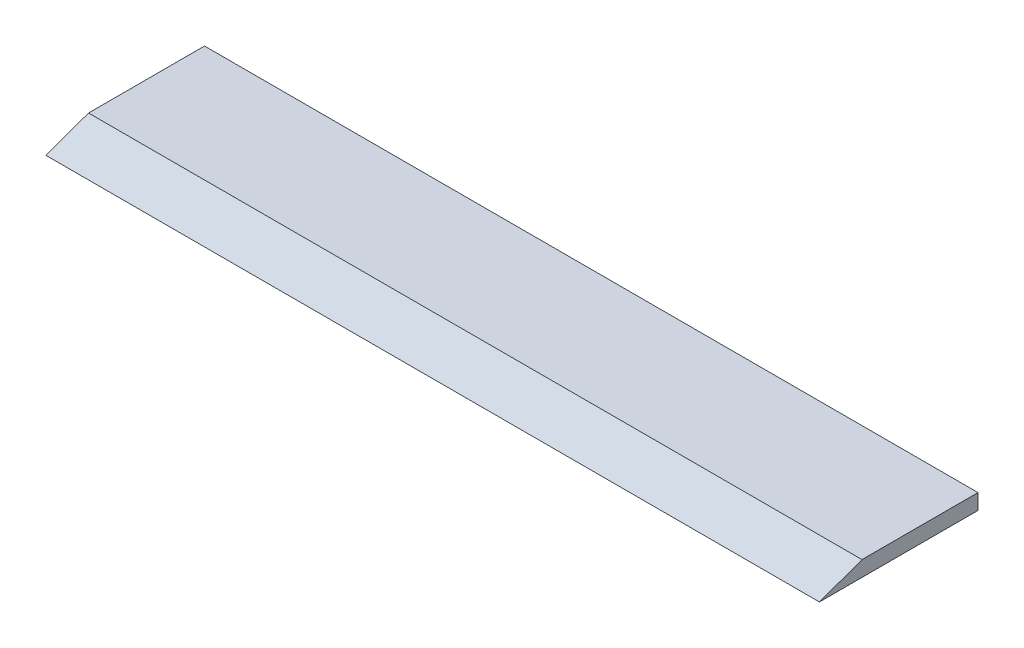
ISO-10303-21;
HEADER;
FILE_DESCRIPTION(('STEP AP214'),'2;1');
FILE_NAME('part.step','',(''),(''),'','','');
FILE_SCHEMA(('AUTOMOTIVE_DESIGN { 1 0 10303 214 1 1 1 1 }'));
ENDSEC;
DATA;
#1=APPLICATION_CONTEXT('core data for automotive mechanical design processes');
#2=APPLICATION_PROTOCOL_DEFINITION('international standard','automotive_design',2000,#1);
#3=PRODUCT_CONTEXT('',#1,'mechanical');
#4=PRODUCT('Part','Part','',(#3));
#5=PRODUCT_RELATED_PRODUCT_CATEGORY('part','',(#4));
#6=PRODUCT_DEFINITION_FORMATION('','',#4);
#7=PRODUCT_DEFINITION_CONTEXT('part definition',#1,'design');
#8=PRODUCT_DEFINITION('design','',#6,#7);
#9=PRODUCT_DEFINITION_SHAPE('','',#8);
#10=(LENGTH_UNIT() NAMED_UNIT(*) SI_UNIT(.MILLI.,.METRE.));
#11=(NAMED_UNIT(*) PLANE_ANGLE_UNIT() SI_UNIT($,.RADIAN.));
#12=(NAMED_UNIT(*) SI_UNIT($,.STERADIAN.) SOLID_ANGLE_UNIT());
#13=UNCERTAINTY_MEASURE_WITH_UNIT(LENGTH_MEASURE(1.E-05),#10,'distance_accuracy_value','');
#14=(GEOMETRIC_REPRESENTATION_CONTEXT(3) GLOBAL_UNCERTAINTY_ASSIGNED_CONTEXT((#13)) GLOBAL_UNIT_ASSIGNED_CONTEXT((#10,
#11,#12)) REPRESENTATION_CONTEXT('',''));
#15=CARTESIAN_POINT('',(0.,0.,0.));
#16=DIRECTION('',(0.,0.,1.));
#17=DIRECTION('',(1.,0.,0.));
#18=AXIS2_PLACEMENT_3D('',#15,#16,#17);
#19=CARTESIAN_POINT('',(200.,0.,0.));
#20=DIRECTION('',(0.,1.,0.));
#21=DIRECTION('',(0.,0.,1.));
#22=AXIS2_PLACEMENT_3D('',#19,#20,#21);
#23=PLANE('',#22);
#24=DIRECTION('',(0.,0.,-1.));
#25=VECTOR('',#24,1.);
#26=CARTESIAN_POINT('',(0.,0.,0.));
#27=LINE('',#26,#25);
#28=CARTESIAN_POINT('',(0.,0.,0.));
#29=VERTEX_POINT('',#28);
#30=CARTESIAN_POINT('',(0.,0.,-40.9899096778185));
#31=VERTEX_POINT('',#30);
#32=EDGE_CURVE('E107',#29,#31,#27,.T.);
#33=ORIENTED_EDGE('',*,*,#32,.T.);
#34=DIRECTION('',(-1.,0.,0.));
#35=VECTOR('',#34,1.);
#36=CARTESIAN_POINT('',(200.,0.,-40.9899096778185));
#37=LINE('',#36,#35);
#38=CARTESIAN_POINT('',(200.,0.,-40.9899096778185));
#39=VERTEX_POINT('',#38);
#40=EDGE_CURVE('E11',#39,#31,#37,.T.);
#41=ORIENTED_EDGE('',*,*,#40,.F.);
#42=DIRECTION('',(0.,0.,-1.));
#43=VECTOR('',#42,1.);
#44=CARTESIAN_POINT('',(200.,0.,0.));
#45=LINE('',#44,#43);
#46=CARTESIAN_POINT('',(200.,0.,0.));
#47=VERTEX_POINT('',#46);
#48=EDGE_CURVE('E91',#47,#39,#45,.T.);
#49=ORIENTED_EDGE('',*,*,#48,.F.);
#50=DIRECTION('',(-1.,0.,0.));
#51=VECTOR('',#50,1.);
#52=CARTESIAN_POINT('',(200.,0.,0.));
#53=LINE('',#52,#51);
#54=EDGE_CURVE('E103',#47,#29,#53,.T.);
#55=ORIENTED_EDGE('',*,*,#54,.T.);
#56=EDGE_LOOP('',(#33,#41,#49,#55));
#57=FACE_BOUND('',#56,.T.);
#58=ADVANCED_FACE('F39',(#57),#23,.F.);
#59=CARTESIAN_POINT('',(200.,0.,-40.9899096778185));
#60=DIRECTION('',(0.,0.,1.));
#61=DIRECTION('',(1.,0.,0.));
#62=AXIS2_PLACEMENT_3D('',#59,#60,#61);
#63=PLANE('',#62);
#64=DIRECTION('',(0.,1.,0.));
#65=VECTOR('',#64,1.);
#66=CARTESIAN_POINT('',(0.,0.,-40.9899096778185));
#67=LINE('',#66,#65);
#68=CARTESIAN_POINT('',(0.,4.,-40.9899096778185));
#69=VERTEX_POINT('',#68);
#70=EDGE_CURVE('E96',#31,#69,#67,.T.);
#71=ORIENTED_EDGE('',*,*,#70,.T.);
#72=DIRECTION('',(-1.,0.,0.));
#73=VECTOR('',#72,1.);
#74=CARTESIAN_POINT('',(200.,4.,-40.9899096778185));
#75=LINE('',#74,#73);
#76=CARTESIAN_POINT('',(200.,4.,-40.9899096778185));
#77=VERTEX_POINT('',#76);
#78=EDGE_CURVE('E48',#77,#69,#75,.T.);
#79=ORIENTED_EDGE('',*,*,#78,.F.);
#80=DIRECTION('',(0.,1.,0.));
#81=VECTOR('',#80,1.);
#82=CARTESIAN_POINT('',(200.,0.,-40.9899096778185));
#83=LINE('',#82,#81);
#84=EDGE_CURVE('E86',#39,#77,#83,.T.);
#85=ORIENTED_EDGE('',*,*,#84,.F.);
#86=ORIENTED_EDGE('',*,*,#40,.T.);
#87=EDGE_LOOP('',(#71,#79,#85,#86));
#88=FACE_BOUND('',#87,.T.);
#89=ADVANCED_FACE('F95',(#88),#63,.F.);
#90=CARTESIAN_POINT('',(200.,4.,-10.9899096778185));
#91=DIRECTION('',(0.,-1.,0.));
#92=DIRECTION('',(0.,0.,-1.));
#93=AXIS2_PLACEMENT_3D('',#90,#91,#92);
#94=PLANE('',#93);
#95=DIRECTION('',(0.,0.,1.));
#96=VECTOR('',#95,1.);
#97=CARTESIAN_POINT('',(0.,4.,-10.9899096778185));
#98=LINE('',#97,#96);
#99=CARTESIAN_POINT('',(0.,4.,-10.9899096778185));
#100=VERTEX_POINT('',#99);
#101=EDGE_CURVE('E73',#69,#100,#98,.T.);
#102=ORIENTED_EDGE('',*,*,#101,.T.);
#103=DIRECTION('',(-1.,0.,0.));
#104=VECTOR('',#103,1.);
#105=CARTESIAN_POINT('',(200.,4.,-10.9899096778185));
#106=LINE('',#105,#104);
#107=CARTESIAN_POINT('',(200.,4.,-10.9899096778185));
#108=VERTEX_POINT('',#107);
#109=EDGE_CURVE('E98',#108,#100,#106,.T.);
#110=ORIENTED_EDGE('',*,*,#109,.F.);
#111=DIRECTION('',(0.,0.,1.));
#112=VECTOR('',#111,1.);
#113=CARTESIAN_POINT('',(200.,4.,-10.9899096778185));
#114=LINE('',#113,#112);
#115=EDGE_CURVE('E89',#77,#108,#114,.T.);
#116=ORIENTED_EDGE('',*,*,#115,.F.);
#117=ORIENTED_EDGE('',*,*,#78,.T.);
#118=EDGE_LOOP('',(#102,#110,#116,#117));
#119=FACE_BOUND('',#118,.T.);
#120=ADVANCED_FACE('F99',(#119),#94,.F.);
#121=CARTESIAN_POINT('',(200.,0.,0.));
#122=DIRECTION('',(0.,-0.939692620785908,-0.342020143325669));
#123=DIRECTION('',(0.,0.342020143325669,-0.939692620785908));
#124=AXIS2_PLACEMENT_3D('',#121,#122,#123);
#125=PLANE('',#124);
#126=DIRECTION('',(0.,-0.342020143325669,0.939692620785908));
#127=VECTOR('',#126,1.);
#128=CARTESIAN_POINT('',(0.,0.,0.));
#129=LINE('',#128,#127);
#130=EDGE_CURVE('E79',#100,#29,#129,.T.);
#131=ORIENTED_EDGE('',*,*,#130,.T.);
#132=ORIENTED_EDGE('',*,*,#54,.F.);
#133=DIRECTION('',(0.,-0.342020143325669,0.939692620785908));
#134=VECTOR('',#133,1.);
#135=CARTESIAN_POINT('',(200.,0.,0.));
#136=LINE('',#135,#134);
#137=EDGE_CURVE('E56',#108,#47,#136,.T.);
#138=ORIENTED_EDGE('',*,*,#137,.F.);
#139=ORIENTED_EDGE('',*,*,#109,.T.);
#140=EDGE_LOOP('',(#131,#132,#138,#139));
#141=FACE_BOUND('',#140,.T.);
#142=ADVANCED_FACE('F120',(#141),#125,.F.);
#143=CARTESIAN_POINT('',(200.,0.,0.));
#144=DIRECTION('',(1.,0.,0.));
#145=DIRECTION('',(0.,0.,-1.));
#146=AXIS2_PLACEMENT_3D('',#143,#144,#145);
#147=PLANE('',#146);
#148=ORIENTED_EDGE('',*,*,#48,.T.);
#149=ORIENTED_EDGE('',*,*,#84,.T.);
#150=ORIENTED_EDGE('',*,*,#115,.T.);
#151=ORIENTED_EDGE('',*,*,#137,.T.);
#152=EDGE_LOOP('',(#148,#149,#150,#151));
#153=FACE_BOUND('',#152,.T.);
#154=ADVANCED_FACE('F87',(#153),#147,.T.);
#155=CARTESIAN_POINT('',(0.,0.,0.));
#156=DIRECTION('',(1.,0.,0.));
#157=DIRECTION('',(0.,0.,-1.));
#158=AXIS2_PLACEMENT_3D('',#155,#156,#157);
#159=PLANE('',#158);
#160=ORIENTED_EDGE('',*,*,#32,.F.);
#161=ORIENTED_EDGE('',*,*,#130,.F.);
#162=ORIENTED_EDGE('',*,*,#101,.F.);
#163=ORIENTED_EDGE('',*,*,#70,.F.);
#164=EDGE_LOOP('',(#160,#161,#162,#163));
#165=FACE_BOUND('',#164,.T.);
#166=ADVANCED_FACE('F123',(#165),#159,.F.);
#167=CLOSED_SHELL('',(#58,#89,#120,#142,#154,#166));
#168=MANIFOLD_SOLID_BREP('B2',#167);
#169=ADVANCED_BREP_SHAPE_REPRESENTATION('',(#18,#168),#14);
#170=SHAPE_DEFINITION_REPRESENTATION(#9,#169);
ENDSEC;
END-ISO-10303-21;
